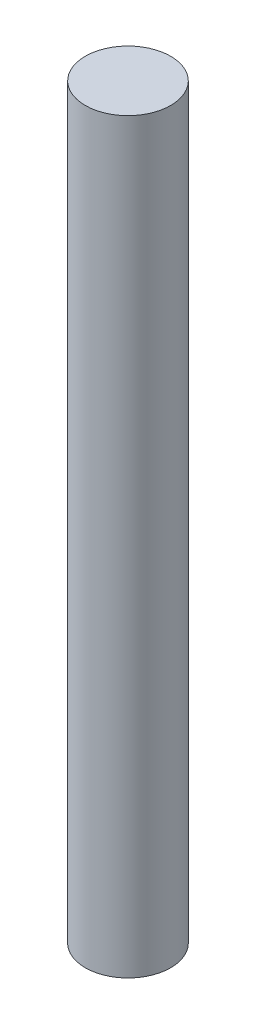
ISO-10303-21;
HEADER;
FILE_DESCRIPTION(('STEP AP214'),'2;1');
FILE_NAME('part.step','',(''),(''),'','','');
FILE_SCHEMA(('AUTOMOTIVE_DESIGN { 1 0 10303 214 1 1 1 1 }'));
ENDSEC;
DATA;
#1=APPLICATION_CONTEXT('core data for automotive mechanical design processes');
#2=APPLICATION_PROTOCOL_DEFINITION('international standard','automotive_design',2000,#1);
#3=PRODUCT_CONTEXT('',#1,'mechanical');
#4=PRODUCT('Part','Part','',(#3));
#5=PRODUCT_RELATED_PRODUCT_CATEGORY('part','',(#4));
#6=PRODUCT_DEFINITION_FORMATION('','',#4);
#7=PRODUCT_DEFINITION_CONTEXT('part definition',#1,'design');
#8=PRODUCT_DEFINITION('design','',#6,#7);
#9=PRODUCT_DEFINITION_SHAPE('','',#8);
#10=(LENGTH_UNIT() NAMED_UNIT(*) SI_UNIT(.MILLI.,.METRE.));
#11=(NAMED_UNIT(*) PLANE_ANGLE_UNIT() SI_UNIT($,.RADIAN.));
#12=(NAMED_UNIT(*) SI_UNIT($,.STERADIAN.) SOLID_ANGLE_UNIT());
#13=UNCERTAINTY_MEASURE_WITH_UNIT(LENGTH_MEASURE(1.E-05),#10,'distance_accuracy_value','');
#14=(GEOMETRIC_REPRESENTATION_CONTEXT(3) GLOBAL_UNCERTAINTY_ASSIGNED_CONTEXT((#13)) GLOBAL_UNIT_ASSIGNED_CONTEXT((#10,
#11,#12)) REPRESENTATION_CONTEXT('',''));
#15=CARTESIAN_POINT('',(0.,0.,0.));
#16=DIRECTION('',(0.,0.,1.));
#17=DIRECTION('',(1.,0.,0.));
#18=AXIS2_PLACEMENT_3D('',#15,#16,#17);
#19=CARTESIAN_POINT('',(0.,35.,0.));
#20=DIRECTION('',(0.,-1.,0.));
#21=DIRECTION('',(0.,0.,-1.));
#22=AXIS2_PLACEMENT_3D('',#19,#20,#21);
#23=CYLINDRICAL_SURFACE('',#22,2.);
#24=CARTESIAN_POINT('',(0.,35.,0.));
#25=DIRECTION('',(0.,1.,0.));
#26=DIRECTION('',(0.,0.,1.));
#27=AXIS2_PLACEMENT_3D('',#24,#25,#26);
#28=CIRCLE('',#27,2.);
#29=CARTESIAN_POINT('',(0.,35.,2.));
#30=VERTEX_POINT('',#29);
#31=EDGE_CURVE('E10',#30,#30,#28,.T.);
#32=ORIENTED_EDGE('',*,*,#31,.F.);
#33=EDGE_LOOP('',(#32));
#34=FACE_BOUND('',#33,.T.);
#35=CARTESIAN_POINT('',(0.,0.,0.));
#36=DIRECTION('',(0.,1.,0.));
#37=DIRECTION('',(0.,0.,1.));
#38=AXIS2_PLACEMENT_3D('',#35,#36,#37);
#39=CIRCLE('',#38,2.);
#40=CARTESIAN_POINT('',(0.,0.,2.));
#41=VERTEX_POINT('',#40);
#42=EDGE_CURVE('E44',#41,#41,#39,.T.);
#43=ORIENTED_EDGE('',*,*,#42,.T.);
#44=EDGE_LOOP('',(#43));
#45=FACE_BOUND('',#44,.T.);
#46=ADVANCED_FACE('F41',(#34,#45),#23,.T.);
#47=CARTESIAN_POINT('',(0.,35.,0.));
#48=DIRECTION('',(0.,1.,0.));
#49=DIRECTION('',(0.,0.,1.));
#50=AXIS2_PLACEMENT_3D('',#47,#48,#49);
#51=PLANE('',#50);
#52=ORIENTED_EDGE('',*,*,#31,.T.);
#53=EDGE_LOOP('',(#52));
#54=FACE_BOUND('',#53,.T.);
#55=ADVANCED_FACE('F56',(#54),#51,.T.);
#56=CARTESIAN_POINT('',(0.,0.,0.));
#57=DIRECTION('',(0.,1.,0.));
#58=DIRECTION('',(0.,0.,1.));
#59=AXIS2_PLACEMENT_3D('',#56,#57,#58);
#60=PLANE('',#59);
#61=ORIENTED_EDGE('',*,*,#42,.F.);
#62=EDGE_LOOP('',(#61));
#63=FACE_BOUND('',#62,.T.);
#64=ADVANCED_FACE('F54',(#63),#60,.F.);
#65=CLOSED_SHELL('',(#46,#55,#64));
#66=MANIFOLD_SOLID_BREP('B2',#65);
#67=ADVANCED_BREP_SHAPE_REPRESENTATION('',(#18,#66),#14);
#68=SHAPE_DEFINITION_REPRESENTATION(#9,#67);
ENDSEC;
END-ISO-10303-21;
